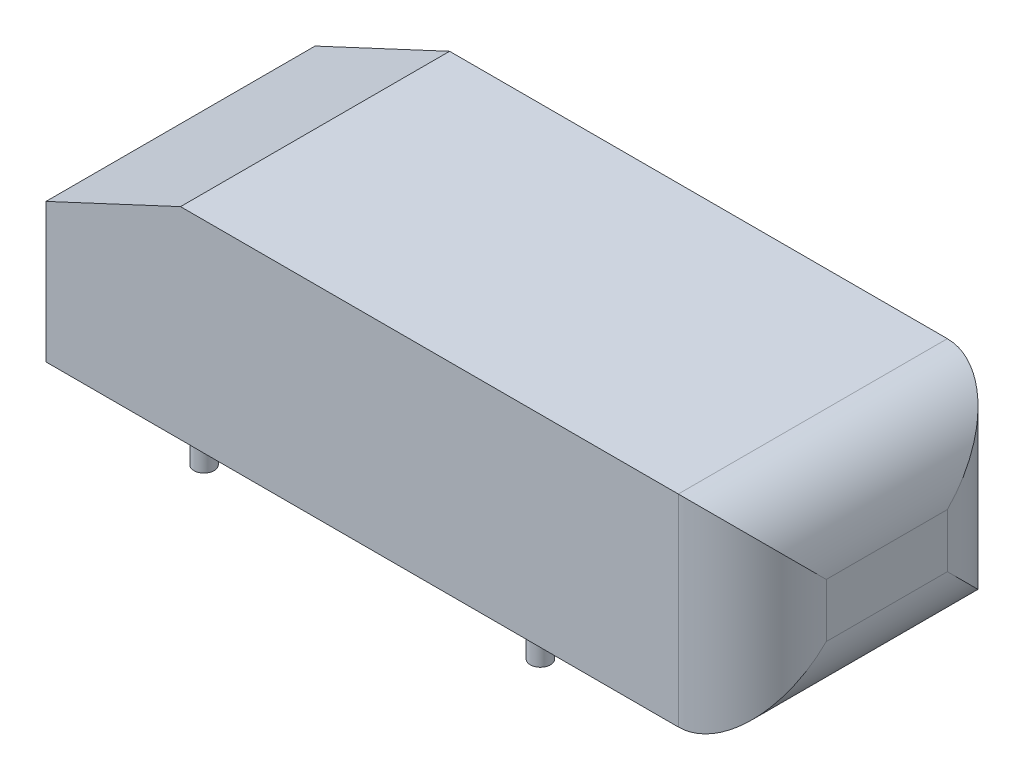
ISO-10303-21;
HEADER;
FILE_DESCRIPTION(('STEP AP214'),'2;1');
FILE_NAME('part.step','',(''),(''),'','','');
FILE_SCHEMA(('AUTOMOTIVE_DESIGN { 1 0 10303 214 1 1 1 1 }'));
ENDSEC;
DATA;
#1=APPLICATION_CONTEXT('core data for automotive mechanical design processes');
#2=APPLICATION_PROTOCOL_DEFINITION('international standard','automotive_design',2000,#1);
#3=PRODUCT_CONTEXT('',#1,'mechanical');
#4=PRODUCT('Part','Part','',(#3));
#5=PRODUCT_RELATED_PRODUCT_CATEGORY('part','',(#4));
#6=PRODUCT_DEFINITION_FORMATION('','',#4);
#7=PRODUCT_DEFINITION_CONTEXT('part definition',#1,'design');
#8=PRODUCT_DEFINITION('design','',#6,#7);
#9=PRODUCT_DEFINITION_SHAPE('','',#8);
#10=(LENGTH_UNIT() NAMED_UNIT(*) SI_UNIT(.MILLI.,.METRE.));
#11=(NAMED_UNIT(*) PLANE_ANGLE_UNIT() SI_UNIT($,.RADIAN.));
#12=(NAMED_UNIT(*) SI_UNIT($,.STERADIAN.) SOLID_ANGLE_UNIT());
#13=UNCERTAINTY_MEASURE_WITH_UNIT(LENGTH_MEASURE(1.E-05),#10,'distance_accuracy_value','');
#14=(GEOMETRIC_REPRESENTATION_CONTEXT(3) GLOBAL_UNCERTAINTY_ASSIGNED_CONTEXT((#13)) GLOBAL_UNIT_ASSIGNED_CONTEXT((#10,
#11,#12)) REPRESENTATION_CONTEXT('',''));
#15=CARTESIAN_POINT('',(0.,0.,0.));
#16=DIRECTION('',(0.,0.,1.));
#17=DIRECTION('',(1.,0.,0.));
#18=AXIS2_PLACEMENT_3D('',#15,#16,#17);
#19=CARTESIAN_POINT('',(-1050.,350.,200.));
#20=DIRECTION('',(0.,0.,1.));
#21=DIRECTION('',(0.,-1.,0.));
#22=AXIS2_PLACEMENT_3D('',#19,#20,#21);
#23=PLANE('',#22);
#24=DIRECTION('',(1.,0.,0.));
#25=VECTOR('',#24,1.);
#26=CARTESIAN_POINT('',(-1050.,350.,200.));
#27=LINE('',#26,#25);
#28=CARTESIAN_POINT('',(-849.999999999999,350.,200.));
#29=VERTEX_POINT('',#28);
#30=CARTESIAN_POINT('',(-110.,350.,200.));
#31=VERTEX_POINT('',#30);
#32=EDGE_CURVE('E121',#29,#31,#27,.T.);
#33=ORIENTED_EDGE('',*,*,#32,.F.);
#34=DIRECTION('',(0.906307787036651,0.422618261740697,0.));
#35=VECTOR('',#34,1.);
#36=CARTESIAN_POINT('',(-1014.27876096865,273.395555688102,200.));
#37=LINE('',#36,#35);
#38=CARTESIAN_POINT('',(-1050.,256.738468369,200.));
#39=VERTEX_POINT('',#38);
#40=EDGE_CURVE('E64',#29,#39,#37,.F.);
#41=ORIENTED_EDGE('',*,*,#40,.T.);
#42=DIRECTION('',(0.,-1.,0.));
#43=VECTOR('',#42,1.);
#44=CARTESIAN_POINT('',(-1050.,350.,200.));
#45=LINE('',#44,#43);
#46=CARTESIAN_POINT('',(-1050.,50.,200.));
#47=VERTEX_POINT('',#46);
#48=EDGE_CURVE('E98',#39,#47,#45,.T.);
#49=ORIENTED_EDGE('',*,*,#48,.T.);
#50=DIRECTION('',(1.,0.,0.));
#51=VECTOR('',#50,1.);
#52=CARTESIAN_POINT('',(-1050.,50.,200.));
#53=LINE('',#52,#51);
#54=CARTESIAN_POINT('',(-110.,50.,200.));
#55=VERTEX_POINT('',#54);
#56=EDGE_CURVE('E101',#47,#55,#53,.T.);
#57=ORIENTED_EDGE('',*,*,#56,.T.);
#58=DIRECTION('',(0.,-1.,0.));
#59=VECTOR('',#58,1.);
#60=CARTESIAN_POINT('',(-110.,350.,200.));
#61=LINE('',#60,#59);
#62=EDGE_CURVE('E141',#55,#31,#61,.F.);
#63=ORIENTED_EDGE('',*,*,#62,.T.);
#64=EDGE_LOOP('',(#33,#41,#49,#57,#63));
#65=FACE_BOUND('',#64,.T.);
#66=ADVANCED_FACE('F41',(#65),#23,.T.);
#67=CARTESIAN_POINT('',(-1050.,350.,-200.));
#68=DIRECTION('',(0.,1.,0.));
#69=DIRECTION('',(0.,0.,1.));
#70=AXIS2_PLACEMENT_3D('',#67,#68,#69);
#71=PLANE('',#70);
#72=DIRECTION('',(1.,0.,0.));
#73=VECTOR('',#72,1.);
#74=CARTESIAN_POINT('',(-1050.,350.,-200.));
#75=LINE('',#74,#73);
#76=CARTESIAN_POINT('',(-849.999999999999,350.,-200.));
#77=VERTEX_POINT('',#76);
#78=CARTESIAN_POINT('',(-110.,350.,-200.));
#79=VERTEX_POINT('',#78);
#80=EDGE_CURVE('E124',#77,#79,#75,.T.);
#81=ORIENTED_EDGE('',*,*,#80,.F.);
#82=DIRECTION('',(0.,0.,1.));
#83=VECTOR('',#82,1.);
#84=CARTESIAN_POINT('',(-849.999999999999,350.,-200.));
#85=LINE('',#84,#83);
#86=EDGE_CURVE('E143',#77,#29,#85,.T.);
#87=ORIENTED_EDGE('',*,*,#86,.T.);
#88=ORIENTED_EDGE('',*,*,#32,.T.);
#89=DIRECTION('',(0.,0.,1.));
#90=VECTOR('',#89,1.);
#91=CARTESIAN_POINT('',(-110.,350.,-200.));
#92=LINE('',#91,#90);
#93=EDGE_CURVE('E135',#31,#79,#92,.F.);
#94=ORIENTED_EDGE('',*,*,#93,.T.);
#95=EDGE_LOOP('',(#81,#87,#88,#94));
#96=FACE_BOUND('',#95,.T.);
#97=ADVANCED_FACE('F160',(#96),#71,.T.);
#98=CARTESIAN_POINT('',(-1050.,350.,-200.));
#99=DIRECTION('',(0.,0.,-1.));
#100=DIRECTION('',(0.,1.,0.));
#101=AXIS2_PLACEMENT_3D('',#98,#99,#100);
#102=PLANE('',#101);
#103=DIRECTION('',(0.,1.,0.));
#104=VECTOR('',#103,1.);
#105=CARTESIAN_POINT('',(-1050.,350.,-200.));
#106=LINE('',#105,#104);
#107=CARTESIAN_POINT('',(-1050.,50.,-200.));
#108=VERTEX_POINT('',#107);
#109=CARTESIAN_POINT('',(-1050.,256.738468369,-200.));
#110=VERTEX_POINT('',#109);
#111=EDGE_CURVE('E114',#108,#110,#106,.T.);
#112=ORIENTED_EDGE('',*,*,#111,.T.);
#113=DIRECTION('',(-0.906307787036651,-0.422618261740697,0.));
#114=VECTOR('',#113,1.);
#115=CARTESIAN_POINT('',(-1014.27876096865,273.395555688102,-200.));
#116=LINE('',#115,#114);
#117=EDGE_CURVE('E11',#110,#77,#116,.F.);
#118=ORIENTED_EDGE('',*,*,#117,.T.);
#119=ORIENTED_EDGE('',*,*,#80,.T.);
#120=DIRECTION('',(0.,1.,0.));
#121=VECTOR('',#120,1.);
#122=CARTESIAN_POINT('',(-110.,50.,-200.));
#123=LINE('',#122,#121);
#124=CARTESIAN_POINT('',(-110.,50.,-200.));
#125=VERTEX_POINT('',#124);
#126=EDGE_CURVE('E138',#79,#125,#123,.F.);
#127=ORIENTED_EDGE('',*,*,#126,.T.);
#128=DIRECTION('',(1.,0.,0.));
#129=VECTOR('',#128,1.);
#130=CARTESIAN_POINT('',(-1050.,50.,-200.));
#131=LINE('',#130,#129);
#132=EDGE_CURVE('E113',#108,#125,#131,.T.);
#133=ORIENTED_EDGE('',*,*,#132,.F.);
#134=EDGE_LOOP('',(#112,#118,#119,#127,#133));
#135=FACE_BOUND('',#134,.T.);
#136=ADVANCED_FACE('F182',(#135),#102,.T.);
#137=CARTESIAN_POINT('',(-1050.,50.,-200.));
#138=DIRECTION('',(0.,-1.,0.));
#139=DIRECTION('',(0.,0.,-1.));
#140=AXIS2_PLACEMENT_3D('',#137,#138,#139);
#141=PLANE('',#140);
#142=CARTESIAN_POINT('',(-850.,50.,-165.));
#143=DIRECTION('',(0.,-1.,0.));
#144=DIRECTION('',(0.,0.,1.));
#145=AXIS2_PLACEMENT_3D('',#142,#143,#144);
#146=CIRCLE('',#145,15.);
#147=CARTESIAN_POINT('',(-850.,50.,-150.));
#148=VERTEX_POINT('',#147);
#149=EDGE_CURVE('E357',#148,#148,#146,.T.);
#150=ORIENTED_EDGE('',*,*,#149,.F.);
#151=EDGE_LOOP('',(#150));
#152=FACE_BOUND('',#151,.T.);
#153=CARTESIAN_POINT('',(-350.,50.,-165.));
#154=DIRECTION('',(0.,-1.,0.));
#155=DIRECTION('',(0.,0.,1.));
#156=AXIS2_PLACEMENT_3D('',#153,#154,#155);
#157=CIRCLE('',#156,15.);
#158=CARTESIAN_POINT('',(-350.,50.,-150.));
#159=VERTEX_POINT('',#158);
#160=EDGE_CURVE('E361',#159,#159,#157,.T.);
#161=ORIENTED_EDGE('',*,*,#160,.F.);
#162=EDGE_LOOP('',(#161));
#163=FACE_BOUND('',#162,.T.);
#164=CARTESIAN_POINT('',(-350.,50.,165.));
#165=DIRECTION('',(0.,-1.,0.));
#166=DIRECTION('',(0.,0.,-1.));
#167=AXIS2_PLACEMENT_3D('',#164,#165,#166);
#168=CIRCLE('',#167,15.);
#169=CARTESIAN_POINT('',(-350.,50.,150.));
#170=VERTEX_POINT('',#169);
#171=EDGE_CURVE('E365',#170,#170,#168,.T.);
#172=ORIENTED_EDGE('',*,*,#171,.F.);
#173=EDGE_LOOP('',(#172));
#174=FACE_BOUND('',#173,.T.);
#175=CARTESIAN_POINT('',(-850.,50.,165.));
#176=DIRECTION('',(0.,-1.,0.));
#177=DIRECTION('',(0.,0.,-1.));
#178=AXIS2_PLACEMENT_3D('',#175,#176,#177);
#179=CIRCLE('',#178,15.);
#180=CARTESIAN_POINT('',(-850.,50.,150.));
#181=VERTEX_POINT('',#180);
#182=EDGE_CURVE('E368',#181,#181,#179,.T.);
#183=ORIENTED_EDGE('',*,*,#182,.F.);
#184=EDGE_LOOP('',(#183));
#185=FACE_BOUND('',#184,.T.);
#186=ORIENTED_EDGE('',*,*,#132,.T.);
#187=DIRECTION('',(0.,0.,-1.));
#188=VECTOR('',#187,1.);
#189=CARTESIAN_POINT('',(-110.,50.,200.));
#190=LINE('',#189,#188);
#191=EDGE_CURVE('E112',#125,#55,#190,.F.);
#192=ORIENTED_EDGE('',*,*,#191,.T.);
#193=ORIENTED_EDGE('',*,*,#56,.F.);
#194=DIRECTION('',(0.,0.,-1.));
#195=VECTOR('',#194,1.);
#196=CARTESIAN_POINT('',(-1050.,50.,-200.));
#197=LINE('',#196,#195);
#198=EDGE_CURVE('E104',#47,#108,#197,.T.);
#199=ORIENTED_EDGE('',*,*,#198,.T.);
#200=EDGE_LOOP('',(#186,#192,#193,#199));
#201=FACE_BOUND('',#200,.T.);
#202=ADVANCED_FACE('F110',(#152,#163,#174,#185,#201),#141,.T.);
#203=CARTESIAN_POINT('',(-1050.,0.,0.));
#204=DIRECTION('',(-1.,0.,0.));
#205=DIRECTION('',(0.,0.,1.));
#206=AXIS2_PLACEMENT_3D('',#203,#204,#205);
#207=PLANE('',#206);
#208=ORIENTED_EDGE('',*,*,#48,.F.);
#209=DIRECTION('',(0.,0.,-1.));
#210=VECTOR('',#209,1.);
#211=CARTESIAN_POINT('',(-1050.,256.738468369,0.));
#212=LINE('',#211,#210);
#213=EDGE_CURVE('E50',#39,#110,#212,.T.);
#214=ORIENTED_EDGE('',*,*,#213,.T.);
#215=ORIENTED_EDGE('',*,*,#111,.F.);
#216=ORIENTED_EDGE('',*,*,#198,.F.);
#217=EDGE_LOOP('',(#208,#214,#215,#216));
#218=FACE_BOUND('',#217,.T.);
#219=ADVANCED_FACE('F116',(#218),#207,.T.);
#220=CARTESIAN_POINT('',(0.,0.,0.));
#221=DIRECTION('',(-1.,0.,0.));
#222=DIRECTION('',(0.,0.,1.));
#223=AXIS2_PLACEMENT_3D('',#220,#221,#222);
#224=PLANE('',#223);
#225=DIRECTION('',(0.,1.,0.));
#226=VECTOR('',#225,1.);
#227=CARTESIAN_POINT('',(0.,350.,-90.));
#228=LINE('',#227,#226);
#229=CARTESIAN_POINT('',(0.,160.,-90.));
#230=VERTEX_POINT('',#229);
#231=CARTESIAN_POINT('',(0.,240.,-90.));
#232=VERTEX_POINT('',#231);
#233=EDGE_CURVE('E130',#230,#232,#228,.T.);
#234=ORIENTED_EDGE('',*,*,#233,.T.);
#235=DIRECTION('',(0.,0.,1.));
#236=VECTOR('',#235,1.);
#237=CARTESIAN_POINT('',(0.,240.,200.));
#238=LINE('',#237,#236);
#239=CARTESIAN_POINT('',(0.,240.,90.));
#240=VERTEX_POINT('',#239);
#241=EDGE_CURVE('E132',#232,#240,#238,.T.);
#242=ORIENTED_EDGE('',*,*,#241,.T.);
#243=DIRECTION('',(0.,-1.,0.));
#244=VECTOR('',#243,1.);
#245=CARTESIAN_POINT('',(0.,50.,90.));
#246=LINE('',#245,#244);
#247=CARTESIAN_POINT('',(0.,160.,90.));
#248=VERTEX_POINT('',#247);
#249=EDGE_CURVE('E123',#240,#248,#246,.T.);
#250=ORIENTED_EDGE('',*,*,#249,.T.);
#251=DIRECTION('',(0.,0.,-1.));
#252=VECTOR('',#251,1.);
#253=CARTESIAN_POINT('',(0.,160.,-200.));
#254=LINE('',#253,#252);
#255=EDGE_CURVE('E128',#248,#230,#254,.T.);
#256=ORIENTED_EDGE('',*,*,#255,.T.);
#257=EDGE_LOOP('',(#234,#242,#250,#256));
#258=FACE_BOUND('',#257,.T.);
#259=ADVANCED_FACE('F176',(#258),#224,.F.);
#260=CARTESIAN_POINT('',(-110.,160.,0.));
#261=DIRECTION('',(0.,0.,1.));
#262=DIRECTION('',(0.,-1.,0.));
#263=AXIS2_PLACEMENT_3D('',#260,#261,#262);
#264=CYLINDRICAL_SURFACE('',#263,110.);
#265=CARTESIAN_POINT('',(-110.,160.,90.));
#266=DIRECTION('',(0.,0.707106781186547,0.707106781186548));
#267=DIRECTION('',(0.,0.707106781186548,-0.707106781186547));
#268=AXIS2_PLACEMENT_3D('',#265,#266,#267);
#269=ELLIPSE('',#268,155.56349186104,110.);
#270=EDGE_CURVE('E150',#55,#248,#269,.T.);
#271=ORIENTED_EDGE('',*,*,#270,.F.);
#272=ORIENTED_EDGE('',*,*,#191,.F.);
#273=CARTESIAN_POINT('',(-110.,160.,-90.));
#274=DIRECTION('',(0.,-0.707106781186548,0.707106781186547));
#275=DIRECTION('',(0.,0.707106781186547,0.707106781186548));
#276=AXIS2_PLACEMENT_3D('',#273,#274,#275);
#277=ELLIPSE('',#276,155.56349186104,110.);
#278=EDGE_CURVE('E105',#230,#125,#277,.F.);
#279=ORIENTED_EDGE('',*,*,#278,.F.);
#280=ORIENTED_EDGE('',*,*,#255,.F.);
#281=EDGE_LOOP('',(#271,#272,#279,#280));
#282=FACE_BOUND('',#281,.T.);
#283=ADVANCED_FACE('F184',(#282),#264,.T.);
#284=CARTESIAN_POINT('',(-110.,0.,-90.));
#285=DIRECTION('',(0.,-1.,0.));
#286=DIRECTION('',(0.,0.,-1.));
#287=AXIS2_PLACEMENT_3D('',#284,#285,#286);
#288=CYLINDRICAL_SURFACE('',#287,110.);
#289=ORIENTED_EDGE('',*,*,#278,.T.);
#290=ORIENTED_EDGE('',*,*,#126,.F.);
#291=CARTESIAN_POINT('',(-110.,240.,-90.));
#292=DIRECTION('',(0.,-0.707106781186547,-0.707106781186547));
#293=DIRECTION('',(0.,-0.707106781186548,0.707106781186547));
#294=AXIS2_PLACEMENT_3D('',#291,#292,#293);
#295=ELLIPSE('',#294,155.56349186104,110.);
#296=EDGE_CURVE('E146',#232,#79,#295,.F.);
#297=ORIENTED_EDGE('',*,*,#296,.F.);
#298=ORIENTED_EDGE('',*,*,#233,.F.);
#299=EDGE_LOOP('',(#289,#290,#297,#298));
#300=FACE_BOUND('',#299,.T.);
#301=ADVANCED_FACE('F180',(#300),#288,.T.);
#302=CARTESIAN_POINT('',(-110.,0.,90.));
#303=DIRECTION('',(0.,1.,0.));
#304=DIRECTION('',(0.,0.,1.));
#305=AXIS2_PLACEMENT_3D('',#302,#303,#304);
#306=CYLINDRICAL_SURFACE('',#305,110.);
#307=ORIENTED_EDGE('',*,*,#270,.T.);
#308=ORIENTED_EDGE('',*,*,#249,.F.);
#309=CARTESIAN_POINT('',(-110.,240.,90.));
#310=DIRECTION('',(0.,0.707106781186548,-0.707106781186547));
#311=DIRECTION('',(0.,0.707106781186547,0.707106781186547));
#312=AXIS2_PLACEMENT_3D('',#309,#310,#311);
#313=ELLIPSE('',#312,155.56349186104,110.);
#314=EDGE_CURVE('E144',#31,#240,#313,.T.);
#315=ORIENTED_EDGE('',*,*,#314,.F.);
#316=ORIENTED_EDGE('',*,*,#62,.F.);
#317=EDGE_LOOP('',(#307,#308,#315,#316));
#318=FACE_BOUND('',#317,.T.);
#319=ADVANCED_FACE('F173',(#318),#306,.T.);
#320=CARTESIAN_POINT('',(-110.,240.,0.));
#321=DIRECTION('',(0.,0.,-1.));
#322=DIRECTION('',(-1.,0.,0.));
#323=AXIS2_PLACEMENT_3D('',#320,#321,#322);
#324=CYLINDRICAL_SURFACE('',#323,110.);
#325=ORIENTED_EDGE('',*,*,#296,.T.);
#326=ORIENTED_EDGE('',*,*,#93,.F.);
#327=ORIENTED_EDGE('',*,*,#314,.T.);
#328=ORIENTED_EDGE('',*,*,#241,.F.);
#329=EDGE_LOOP('',(#325,#326,#327,#328));
#330=FACE_BOUND('',#329,.T.);
#331=ADVANCED_FACE('F168',(#330),#324,.T.);
#332=CARTESIAN_POINT('',(-849.999999999999,350.,-200.));
#333=DIRECTION('',(0.422618261740697,-0.906307787036651,0.));
#334=DIRECTION('',(0.,0.,1.));
#335=AXIS2_PLACEMENT_3D('',#332,#333,#334);
#336=PLANE('',#335);
#337=ORIENTED_EDGE('',*,*,#117,.F.);
#338=ORIENTED_EDGE('',*,*,#213,.F.);
#339=ORIENTED_EDGE('',*,*,#40,.F.);
#340=ORIENTED_EDGE('',*,*,#86,.F.);
#341=EDGE_LOOP('',(#337,#338,#339,#340));
#342=FACE_BOUND('',#341,.T.);
#343=ADVANCED_FACE('F44',(#342),#336,.F.);
#344=CARTESIAN_POINT('',(-850.,0.,165.));
#345=DIRECTION('',(0.,1.,0.));
#346=DIRECTION('',(0.,0.,1.));
#347=AXIS2_PLACEMENT_3D('',#344,#345,#346);
#348=CYLINDRICAL_SURFACE('',#347,15.);
#349=CARTESIAN_POINT('',(-850.,0.,165.));
#350=DIRECTION('',(0.,-1.,0.));
#351=DIRECTION('',(0.,0.,-1.));
#352=AXIS2_PLACEMENT_3D('',#349,#350,#351);
#353=CIRCLE('',#352,15.);
#354=CARTESIAN_POINT('',(-850.,0.,150.));
#355=VERTEX_POINT('',#354);
#356=EDGE_CURVE('E147',#355,#355,#353,.T.);
#357=ORIENTED_EDGE('',*,*,#356,.F.);
#358=EDGE_LOOP('',(#357));
#359=FACE_BOUND('',#358,.T.);
#360=ORIENTED_EDGE('',*,*,#182,.T.);
#361=EDGE_LOOP('',(#360));
#362=FACE_BOUND('',#361,.T.);
#363=ADVANCED_FACE('F219',(#359,#362),#348,.T.);
#364=CARTESIAN_POINT('',(-850.,0.,165.));
#365=DIRECTION('',(0.,-1.,0.));
#366=DIRECTION('',(0.,0.,-1.));
#367=AXIS2_PLACEMENT_3D('',#364,#365,#366);
#368=PLANE('',#367);
#369=ORIENTED_EDGE('',*,*,#356,.T.);
#370=EDGE_LOOP('',(#369));
#371=FACE_BOUND('',#370,.T.);
#372=ADVANCED_FACE('F227',(#371),#368,.T.);
#373=CARTESIAN_POINT('',(-350.,0.,165.));
#374=DIRECTION('',(0.,1.,0.));
#375=DIRECTION('',(0.,0.,1.));
#376=AXIS2_PLACEMENT_3D('',#373,#374,#375);
#377=CYLINDRICAL_SURFACE('',#376,15.);
#378=CARTESIAN_POINT('',(-350.,0.,165.));
#379=DIRECTION('',(0.,-1.,0.));
#380=DIRECTION('',(0.,0.,-1.));
#381=AXIS2_PLACEMENT_3D('',#378,#379,#380);
#382=CIRCLE('',#381,15.);
#383=CARTESIAN_POINT('',(-350.,0.,150.));
#384=VERTEX_POINT('',#383);
#385=EDGE_CURVE('E370',#384,#384,#382,.T.);
#386=ORIENTED_EDGE('',*,*,#385,.F.);
#387=EDGE_LOOP('',(#386));
#388=FACE_BOUND('',#387,.T.);
#389=ORIENTED_EDGE('',*,*,#171,.T.);
#390=EDGE_LOOP('',(#389));
#391=FACE_BOUND('',#390,.T.);
#392=ADVANCED_FACE('F235',(#388,#391),#377,.T.);
#393=CARTESIAN_POINT('',(-350.,0.,165.));
#394=DIRECTION('',(0.,-1.,0.));
#395=DIRECTION('',(0.,0.,-1.));
#396=AXIS2_PLACEMENT_3D('',#393,#394,#395);
#397=PLANE('',#396);
#398=ORIENTED_EDGE('',*,*,#385,.T.);
#399=EDGE_LOOP('',(#398));
#400=FACE_BOUND('',#399,.T.);
#401=ADVANCED_FACE('F243',(#400),#397,.T.);
#402=CARTESIAN_POINT('',(-350.,0.,-165.));
#403=DIRECTION('',(0.,1.,0.));
#404=DIRECTION('',(0.,0.,1.));
#405=AXIS2_PLACEMENT_3D('',#402,#403,#404);
#406=CYLINDRICAL_SURFACE('',#405,15.);
#407=CARTESIAN_POINT('',(-350.,0.,-165.));
#408=DIRECTION('',(0.,-1.,0.));
#409=DIRECTION('',(0.,0.,1.));
#410=AXIS2_PLACEMENT_3D('',#407,#408,#409);
#411=CIRCLE('',#410,15.);
#412=CARTESIAN_POINT('',(-350.,0.,-150.));
#413=VERTEX_POINT('',#412);
#414=EDGE_CURVE('E376',#413,#413,#411,.T.);
#415=ORIENTED_EDGE('',*,*,#414,.F.);
#416=EDGE_LOOP('',(#415));
#417=FACE_BOUND('',#416,.T.);
#418=ORIENTED_EDGE('',*,*,#160,.T.);
#419=EDGE_LOOP('',(#418));
#420=FACE_BOUND('',#419,.T.);
#421=ADVANCED_FACE('F251',(#417,#420),#406,.T.);
#422=CARTESIAN_POINT('',(-350.,0.,-165.));
#423=DIRECTION('',(0.,1.,0.));
#424=DIRECTION('',(0.,0.,1.));
#425=AXIS2_PLACEMENT_3D('',#422,#423,#424);
#426=PLANE('',#425);
#427=ORIENTED_EDGE('',*,*,#414,.T.);
#428=EDGE_LOOP('',(#427));
#429=FACE_BOUND('',#428,.T.);
#430=ADVANCED_FACE('F259',(#429),#426,.F.);
#431=CARTESIAN_POINT('',(-850.,0.,-165.));
#432=DIRECTION('',(0.,1.,0.));
#433=DIRECTION('',(0.,0.,1.));
#434=AXIS2_PLACEMENT_3D('',#431,#432,#433);
#435=CYLINDRICAL_SURFACE('',#434,15.);
#436=CARTESIAN_POINT('',(-850.,0.,-165.));
#437=DIRECTION('',(0.,-1.,0.));
#438=DIRECTION('',(0.,0.,1.));
#439=AXIS2_PLACEMENT_3D('',#436,#437,#438);
#440=CIRCLE('',#439,15.);
#441=CARTESIAN_POINT('',(-850.,0.,-150.));
#442=VERTEX_POINT('',#441);
#443=EDGE_CURVE('E379',#442,#442,#440,.T.);
#444=ORIENTED_EDGE('',*,*,#443,.F.);
#445=EDGE_LOOP('',(#444));
#446=FACE_BOUND('',#445,.T.);
#447=ORIENTED_EDGE('',*,*,#149,.T.);
#448=EDGE_LOOP('',(#447));
#449=FACE_BOUND('',#448,.T.);
#450=ADVANCED_FACE('F267',(#446,#449),#435,.T.);
#451=CARTESIAN_POINT('',(-850.,0.,-165.));
#452=DIRECTION('',(0.,1.,0.));
#453=DIRECTION('',(0.,0.,1.));
#454=AXIS2_PLACEMENT_3D('',#451,#452,#453);
#455=PLANE('',#454);
#456=ORIENTED_EDGE('',*,*,#443,.T.);
#457=EDGE_LOOP('',(#456));
#458=FACE_BOUND('',#457,.T.);
#459=ADVANCED_FACE('F275',(#458),#455,.F.);
#460=CLOSED_SHELL('',(#66,#97,#136,#202,#219,#259,#283,#301,#319,#331,#343,#363,#372,#392,#401,
#421,#430,#450,#459));
#461=MANIFOLD_SOLID_BREP('B2',#460);
#462=ADVANCED_BREP_SHAPE_REPRESENTATION('',(#18,#461),#14);
#463=SHAPE_DEFINITION_REPRESENTATION(#9,#462);
ENDSEC;
END-ISO-10303-21;
